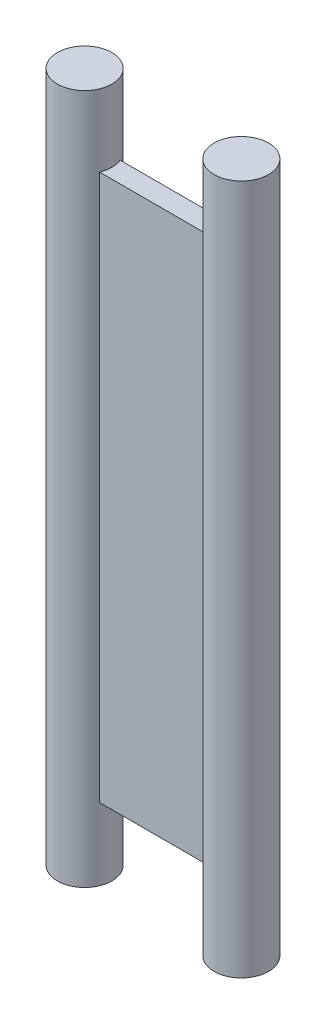
ISO-10303-21;
HEADER;
FILE_DESCRIPTION(('STEP AP214'),'2;1');
FILE_NAME('part.step','',(''),(''),'','','');
FILE_SCHEMA(('AUTOMOTIVE_DESIGN { 1 0 10303 214 1 1 1 1 }'));
ENDSEC;
DATA;
#1=APPLICATION_CONTEXT('core data for automotive mechanical design processes');
#2=APPLICATION_PROTOCOL_DEFINITION('international standard','automotive_design',2000,#1);
#3=PRODUCT_CONTEXT('',#1,'mechanical');
#4=PRODUCT('Part','Part','',(#3));
#5=PRODUCT_RELATED_PRODUCT_CATEGORY('part','',(#4));
#6=PRODUCT_DEFINITION_FORMATION('','',#4);
#7=PRODUCT_DEFINITION_CONTEXT('part definition',#1,'design');
#8=PRODUCT_DEFINITION('design','',#6,#7);
#9=PRODUCT_DEFINITION_SHAPE('','',#8);
#10=(LENGTH_UNIT() NAMED_UNIT(*) SI_UNIT(.MILLI.,.METRE.));
#11=(NAMED_UNIT(*) PLANE_ANGLE_UNIT() SI_UNIT($,.RADIAN.));
#12=(NAMED_UNIT(*) SI_UNIT($,.STERADIAN.) SOLID_ANGLE_UNIT());
#13=UNCERTAINTY_MEASURE_WITH_UNIT(LENGTH_MEASURE(1.E-05),#10,'distance_accuracy_value','');
#14=(GEOMETRIC_REPRESENTATION_CONTEXT(3) GLOBAL_UNCERTAINTY_ASSIGNED_CONTEXT((#13)) GLOBAL_UNIT_ASSIGNED_CONTEXT((#10,
#11,#12)) REPRESENTATION_CONTEXT('',''));
#15=CARTESIAN_POINT('',(0.,0.,0.));
#16=DIRECTION('',(0.,0.,1.));
#17=DIRECTION('',(1.,0.,0.));
#18=AXIS2_PLACEMENT_3D('',#15,#16,#17);
#19=CARTESIAN_POINT('',(3.803,26.5,0.5));
#20=DIRECTION('',(0.,0.,-1.));
#21=DIRECTION('',(-1.,0.,0.));
#22=AXIS2_PLACEMENT_3D('',#19,#20,#21);
#23=PLANE('',#22);
#24=DIRECTION('',(0.,-1.,0.));
#25=VECTOR('',#24,1.);
#26=CARTESIAN_POINT('',(2.5759608808192,30.,0.5));
#27=LINE('',#26,#25);
#28=CARTESIAN_POINT('',(2.5759608808192,26.5,0.5));
#29=VERTEX_POINT('',#28);
#30=CARTESIAN_POINT('',(2.5759608808192,0.,0.499999999999999));
#31=VERTEX_POINT('',#30);
#32=EDGE_CURVE('E53',#29,#31,#27,.T.);
#33=ORIENTED_EDGE('',*,*,#32,.F.);
#34=DIRECTION('',(1.,0.,0.));
#35=VECTOR('',#34,1.);
#36=CARTESIAN_POINT('',(3.803,26.5,0.5));
#37=LINE('',#36,#35);
#38=CARTESIAN_POINT('',(-2.5759608808192,26.5,0.5));
#39=VERTEX_POINT('',#38);
#40=EDGE_CURVE('E90',#39,#29,#37,.T.);
#41=ORIENTED_EDGE('',*,*,#40,.F.);
#42=DIRECTION('',(0.,-1.,0.));
#43=VECTOR('',#42,1.);
#44=CARTESIAN_POINT('',(-2.5759608808192,30.,0.5));
#45=LINE('',#44,#43);
#46=CARTESIAN_POINT('',(-2.5759608808192,0.,0.5));
#47=VERTEX_POINT('',#46);
#48=EDGE_CURVE('E103',#47,#39,#45,.F.);
#49=ORIENTED_EDGE('',*,*,#48,.F.);
#50=DIRECTION('',(1.,0.,0.));
#51=VECTOR('',#50,1.);
#52=CARTESIAN_POINT('',(3.803,0.,0.5));
#53=LINE('',#52,#51);
#54=EDGE_CURVE('E91',#47,#31,#53,.T.);
#55=ORIENTED_EDGE('',*,*,#54,.T.);
#56=EDGE_LOOP('',(#33,#41,#49,#55));
#57=FACE_BOUND('',#56,.T.);
#58=ADVANCED_FACE('F39',(#57),#23,.F.);
#59=CARTESIAN_POINT('',(3.803,26.5,-0.5));
#60=DIRECTION('',(0.,0.,1.));
#61=DIRECTION('',(1.,0.,0.));
#62=AXIS2_PLACEMENT_3D('',#59,#60,#61);
#63=PLANE('',#62);
#64=DIRECTION('',(0.,-1.,0.));
#65=VECTOR('',#64,1.);
#66=CARTESIAN_POINT('',(2.5759608808192,30.,-0.5));
#67=LINE('',#66,#65);
#68=CARTESIAN_POINT('',(2.5759608808192,0.,-0.5));
#69=VERTEX_POINT('',#68);
#70=CARTESIAN_POINT('',(2.5759608808192,26.5,-0.5));
#71=VERTEX_POINT('',#70);
#72=EDGE_CURVE('E78',#69,#71,#67,.F.);
#73=ORIENTED_EDGE('',*,*,#72,.F.);
#74=DIRECTION('',(-1.,0.,0.));
#75=VECTOR('',#74,1.);
#76=CARTESIAN_POINT('',(3.803,0.,-0.5));
#77=LINE('',#76,#75);
#78=CARTESIAN_POINT('',(-2.5759608808192,0.,-0.499999999999999));
#79=VERTEX_POINT('',#78);
#80=EDGE_CURVE('E60',#69,#79,#77,.T.);
#81=ORIENTED_EDGE('',*,*,#80,.T.);
#82=DIRECTION('',(0.,-1.,0.));
#83=VECTOR('',#82,1.);
#84=CARTESIAN_POINT('',(-2.5759608808192,30.,-0.5));
#85=LINE('',#84,#83);
#86=CARTESIAN_POINT('',(-2.5759608808192,26.5,-0.5));
#87=VERTEX_POINT('',#86);
#88=EDGE_CURVE('E105',#87,#79,#85,.T.);
#89=ORIENTED_EDGE('',*,*,#88,.F.);
#90=DIRECTION('',(-1.,0.,0.));
#91=VECTOR('',#90,1.);
#92=CARTESIAN_POINT('',(3.803,26.5,-0.5));
#93=LINE('',#92,#91);
#94=EDGE_CURVE('E85',#71,#87,#93,.T.);
#95=ORIENTED_EDGE('',*,*,#94,.F.);
#96=EDGE_LOOP('',(#73,#81,#89,#95));
#97=FACE_BOUND('',#96,.T.);
#98=ADVANCED_FACE('F84',(#97),#63,.F.);
#99=CARTESIAN_POINT('',(-3.803,30.,0.));
#100=DIRECTION('',(0.,-1.,0.));
#101=DIRECTION('',(0.,0.,-1.));
#102=AXIS2_PLACEMENT_3D('',#99,#100,#101);
#103=CYLINDRICAL_SURFACE('',#102,1.325);
#104=CARTESIAN_POINT('',(-3.803,30.,0.));
#105=DIRECTION('',(0.,1.,0.));
#106=DIRECTION('',(0.,0.,1.));
#107=AXIS2_PLACEMENT_3D('',#104,#105,#106);
#108=CIRCLE('',#107,1.325);
#109=CARTESIAN_POINT('',(-3.803,30.,1.325));
#110=VERTEX_POINT('',#109);
#111=EDGE_CURVE('E107',#110,#110,#108,.T.);
#112=ORIENTED_EDGE('',*,*,#111,.F.);
#113=EDGE_LOOP('',(#112));
#114=FACE_BOUND('',#113,.T.);
#115=CARTESIAN_POINT('',(-3.803,-3.5,0.));
#116=DIRECTION('',(0.,1.,0.));
#117=DIRECTION('',(0.,0.,1.));
#118=AXIS2_PLACEMENT_3D('',#115,#116,#117);
#119=CIRCLE('',#118,1.325);
#120=CARTESIAN_POINT('',(-3.803,-3.5,1.325));
#121=VERTEX_POINT('',#120);
#122=EDGE_CURVE('E108',#121,#121,#119,.T.);
#123=ORIENTED_EDGE('',*,*,#122,.T.);
#124=EDGE_LOOP('',(#123));
#125=FACE_BOUND('',#124,.T.);
#126=ORIENTED_EDGE('',*,*,#48,.T.);
#127=CARTESIAN_POINT('',(-3.803,26.5,0.));
#128=DIRECTION('',(0.,-1.,0.));
#129=DIRECTION('',(0.,0.,-1.));
#130=AXIS2_PLACEMENT_3D('',#127,#128,#129);
#131=CIRCLE('',#130,1.325);
#132=EDGE_CURVE('E95',#39,#87,#131,.F.);
#133=ORIENTED_EDGE('',*,*,#132,.T.);
#134=ORIENTED_EDGE('',*,*,#88,.T.);
#135=CARTESIAN_POINT('',(-3.803,0.,0.));
#136=DIRECTION('',(0.,-1.,0.));
#137=DIRECTION('',(0.,0.,-1.));
#138=AXIS2_PLACEMENT_3D('',#135,#136,#137);
#139=CIRCLE('',#138,1.325);
#140=EDGE_CURVE('E46',#47,#79,#139,.F.);
#141=ORIENTED_EDGE('',*,*,#140,.F.);
#142=EDGE_LOOP('',(#126,#133,#134,#141));
#143=FACE_BOUND('',#142,.T.);
#144=ADVANCED_FACE('F138',(#114,#125,#143),#103,.T.);
#145=CARTESIAN_POINT('',(-3.803,30.,0.));
#146=DIRECTION('',(0.,1.,0.));
#147=DIRECTION('',(0.,0.,1.));
#148=AXIS2_PLACEMENT_3D('',#145,#146,#147);
#149=PLANE('',#148);
#150=ORIENTED_EDGE('',*,*,#111,.T.);
#151=EDGE_LOOP('',(#150));
#152=FACE_BOUND('',#151,.T.);
#153=ADVANCED_FACE('F144',(#152),#149,.T.);
#154=CARTESIAN_POINT('',(-3.803,-3.5,0.));
#155=DIRECTION('',(0.,1.,0.));
#156=DIRECTION('',(0.,0.,1.));
#157=AXIS2_PLACEMENT_3D('',#154,#155,#156);
#158=PLANE('',#157);
#159=ORIENTED_EDGE('',*,*,#122,.F.);
#160=EDGE_LOOP('',(#159));
#161=FACE_BOUND('',#160,.T.);
#162=ADVANCED_FACE('F150',(#161),#158,.F.);
#163=CARTESIAN_POINT('',(0.,26.5,0.));
#164=DIRECTION('',(0.,-1.,0.));
#165=DIRECTION('',(0.,0.,-1.));
#166=AXIS2_PLACEMENT_3D('',#163,#164,#165);
#167=PLANE('',#166);
#168=CARTESIAN_POINT('',(3.803,26.5,0.));
#169=DIRECTION('',(0.,-1.,0.));
#170=DIRECTION('',(0.,0.,-1.));
#171=AXIS2_PLACEMENT_3D('',#168,#169,#170);
#172=CIRCLE('',#171,1.325);
#173=EDGE_CURVE('E111',#71,#29,#172,.F.);
#174=ORIENTED_EDGE('',*,*,#173,.F.);
#175=ORIENTED_EDGE('',*,*,#94,.T.);
#176=ORIENTED_EDGE('',*,*,#132,.F.);
#177=ORIENTED_EDGE('',*,*,#40,.T.);
#178=EDGE_LOOP('',(#174,#175,#176,#177));
#179=FACE_BOUND('',#178,.T.);
#180=ADVANCED_FACE('F141',(#179),#167,.F.);
#181=CARTESIAN_POINT('',(0.,0.,0.));
#182=DIRECTION('',(0.,-1.,0.));
#183=DIRECTION('',(0.,0.,-1.));
#184=AXIS2_PLACEMENT_3D('',#181,#182,#183);
#185=PLANE('',#184);
#186=ORIENTED_EDGE('',*,*,#80,.F.);
#187=CARTESIAN_POINT('',(3.803,0.,0.));
#188=DIRECTION('',(0.,-1.,0.));
#189=DIRECTION('',(0.,0.,-1.));
#190=AXIS2_PLACEMENT_3D('',#187,#188,#189);
#191=CIRCLE('',#190,1.325);
#192=EDGE_CURVE('E11',#69,#31,#191,.F.);
#193=ORIENTED_EDGE('',*,*,#192,.T.);
#194=ORIENTED_EDGE('',*,*,#54,.F.);
#195=ORIENTED_EDGE('',*,*,#140,.T.);
#196=EDGE_LOOP('',(#186,#193,#194,#195));
#197=FACE_BOUND('',#196,.T.);
#198=ADVANCED_FACE('F89',(#197),#185,.T.);
#199=CARTESIAN_POINT('',(3.803,30.,0.));
#200=DIRECTION('',(0.,-1.,0.));
#201=DIRECTION('',(0.,0.,-1.));
#202=AXIS2_PLACEMENT_3D('',#199,#200,#201);
#203=CYLINDRICAL_SURFACE('',#202,1.325);
#204=CARTESIAN_POINT('',(3.803,30.,0.));
#205=DIRECTION('',(0.,1.,0.));
#206=DIRECTION('',(0.,0.,1.));
#207=AXIS2_PLACEMENT_3D('',#204,#205,#206);
#208=CIRCLE('',#207,1.325);
#209=CARTESIAN_POINT('',(3.803,30.,1.325));
#210=VERTEX_POINT('',#209);
#211=EDGE_CURVE('E116',#210,#210,#208,.T.);
#212=ORIENTED_EDGE('',*,*,#211,.F.);
#213=EDGE_LOOP('',(#212));
#214=FACE_BOUND('',#213,.T.);
#215=CARTESIAN_POINT('',(3.803,-3.5,0.));
#216=DIRECTION('',(0.,1.,0.));
#217=DIRECTION('',(0.,0.,1.));
#218=AXIS2_PLACEMENT_3D('',#215,#216,#217);
#219=CIRCLE('',#218,1.325);
#220=CARTESIAN_POINT('',(3.803,-3.5,1.325));
#221=VERTEX_POINT('',#220);
#222=EDGE_CURVE('E86',#221,#221,#219,.T.);
#223=ORIENTED_EDGE('',*,*,#222,.T.);
#224=EDGE_LOOP('',(#223));
#225=FACE_BOUND('',#224,.T.);
#226=ORIENTED_EDGE('',*,*,#72,.T.);
#227=ORIENTED_EDGE('',*,*,#173,.T.);
#228=ORIENTED_EDGE('',*,*,#32,.T.);
#229=ORIENTED_EDGE('',*,*,#192,.F.);
#230=EDGE_LOOP('',(#226,#227,#228,#229));
#231=FACE_BOUND('',#230,.T.);
#232=ADVANCED_FACE('F77',(#214,#225,#231),#203,.T.);
#233=CARTESIAN_POINT('',(3.803,30.,0.));
#234=DIRECTION('',(0.,1.,0.));
#235=DIRECTION('',(0.,0.,1.));
#236=AXIS2_PLACEMENT_3D('',#233,#234,#235);
#237=PLANE('',#236);
#238=ORIENTED_EDGE('',*,*,#211,.T.);
#239=EDGE_LOOP('',(#238));
#240=FACE_BOUND('',#239,.T.);
#241=ADVANCED_FACE('F125',(#240),#237,.T.);
#242=CARTESIAN_POINT('',(3.803,-3.5,0.));
#243=DIRECTION('',(0.,1.,0.));
#244=DIRECTION('',(0.,0.,1.));
#245=AXIS2_PLACEMENT_3D('',#242,#243,#244);
#246=PLANE('',#245);
#247=ORIENTED_EDGE('',*,*,#222,.F.);
#248=EDGE_LOOP('',(#247));
#249=FACE_BOUND('',#248,.T.);
#250=ADVANCED_FACE('F123',(#249),#246,.F.);
#251=CLOSED_SHELL('',(#58,#98,#144,#153,#162,#180,#198,#232,#241,#250));
#252=MANIFOLD_SOLID_BREP('B2',#251);
#253=ADVANCED_BREP_SHAPE_REPRESENTATION('',(#18,#252),#14);
#254=SHAPE_DEFINITION_REPRESENTATION(#9,#253);
ENDSEC;
END-ISO-10303-21;
